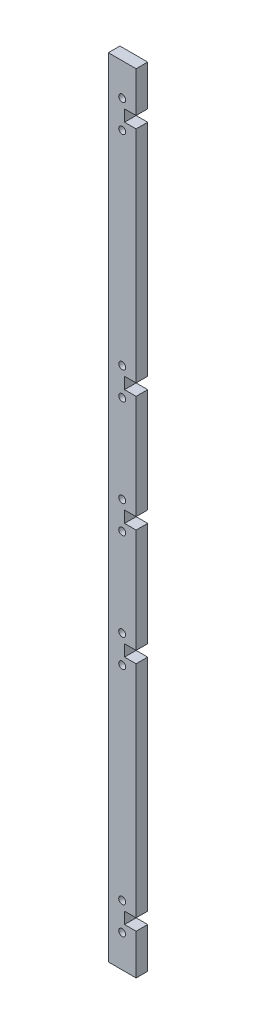
ISO-10303-21;
HEADER;
FILE_DESCRIPTION(('STEP AP214'),'2;1');
FILE_NAME('part.step','',(''),(''),'','','');
FILE_SCHEMA(('AUTOMOTIVE_DESIGN { 1 0 10303 214 1 1 1 1 }'));
ENDSEC;
DATA;
#1=APPLICATION_CONTEXT('core data for automotive mechanical design processes');
#2=APPLICATION_PROTOCOL_DEFINITION('international standard','automotive_design',2000,#1);
#3=PRODUCT_CONTEXT('',#1,'mechanical');
#4=PRODUCT('Part','Part','',(#3));
#5=PRODUCT_RELATED_PRODUCT_CATEGORY('part','',(#4));
#6=PRODUCT_DEFINITION_FORMATION('','',#4);
#7=PRODUCT_DEFINITION_CONTEXT('part definition',#1,'design');
#8=PRODUCT_DEFINITION('design','',#6,#7);
#9=PRODUCT_DEFINITION_SHAPE('','',#8);
#10=(LENGTH_UNIT() NAMED_UNIT(*) SI_UNIT(.MILLI.,.METRE.));
#11=(NAMED_UNIT(*) PLANE_ANGLE_UNIT() SI_UNIT($,.RADIAN.));
#12=(NAMED_UNIT(*) SI_UNIT($,.STERADIAN.) SOLID_ANGLE_UNIT());
#13=UNCERTAINTY_MEASURE_WITH_UNIT(LENGTH_MEASURE(1.E-05),#10,'distance_accuracy_value','');
#14=(GEOMETRIC_REPRESENTATION_CONTEXT(3) GLOBAL_UNCERTAINTY_ASSIGNED_CONTEXT((#13)) GLOBAL_UNIT_ASSIGNED_CONTEXT((#10,
#11,#12)) REPRESENTATION_CONTEXT('',''));
#15=CARTESIAN_POINT('',(0.,0.,0.));
#16=DIRECTION('',(0.,0.,1.));
#17=DIRECTION('',(1.,0.,0.));
#18=AXIS2_PLACEMENT_3D('',#15,#16,#17);
#19=CARTESIAN_POINT('',(0.,0.,5.));
#20=DIRECTION('',(0.,0.,1.));
#21=DIRECTION('',(1.,0.,0.));
#22=AXIS2_PLACEMENT_3D('',#19,#20,#21);
#23=PLANE('',#22);
#24=CARTESIAN_POINT('',(0.,126.,5.));
#25=DIRECTION('',(0.,0.,1.));
#26=DIRECTION('',(1.,0.,0.));
#27=AXIS2_PLACEMENT_3D('',#24,#25,#26);
#28=CIRCLE('',#27,1.5);
#29=CARTESIAN_POINT('',(1.49999999999998,126.,5.));
#30=VERTEX_POINT('',#29);
#31=EDGE_CURVE('E475',#30,#30,#28,.T.);
#32=ORIENTED_EDGE('',*,*,#31,.F.);
#33=EDGE_LOOP('',(#32));
#34=FACE_BOUND('',#33,.T.);
#35=CARTESIAN_POINT('',(0.,26.,5.));
#36=DIRECTION('',(0.,0.,1.));
#37=DIRECTION('',(1.,0.,0.));
#38=AXIS2_PLACEMENT_3D('',#35,#36,#37);
#39=CIRCLE('',#38,1.5);
#40=CARTESIAN_POINT('',(1.50000000000005,26.,5.));
#41=VERTEX_POINT('',#40);
#42=EDGE_CURVE('E487',#41,#41,#39,.T.);
#43=ORIENTED_EDGE('',*,*,#42,.F.);
#44=EDGE_LOOP('',(#43));
#45=FACE_BOUND('',#44,.T.);
#46=CARTESIAN_POINT('',(0.,176.,5.));
#47=DIRECTION('',(0.,0.,1.));
#48=DIRECTION('',(1.,0.,0.));
#49=AXIS2_PLACEMENT_3D('',#46,#47,#48);
#50=CIRCLE('',#49,1.5);
#51=CARTESIAN_POINT('',(1.50000000000003,176.,5.));
#52=VERTEX_POINT('',#51);
#53=EDGE_CURVE('E499',#52,#52,#50,.T.);
#54=ORIENTED_EDGE('',*,*,#53,.F.);
#55=EDGE_LOOP('',(#54));
#56=FACE_BOUND('',#55,.T.);
#57=CARTESIAN_POINT('',(0.,226.,5.));
#58=DIRECTION('',(0.,0.,1.));
#59=DIRECTION('',(1.,0.,0.));
#60=AXIS2_PLACEMENT_3D('',#57,#58,#59);
#61=CIRCLE('',#60,1.5);
#62=CARTESIAN_POINT('',(1.50000000000003,226.,5.));
#63=VERTEX_POINT('',#62);
#64=EDGE_CURVE('E511',#63,#63,#61,.T.);
#65=ORIENTED_EDGE('',*,*,#64,.F.);
#66=EDGE_LOOP('',(#65));
#67=FACE_BOUND('',#66,.T.);
#68=CARTESIAN_POINT('',(0.,326.,5.));
#69=DIRECTION('',(0.,0.,1.));
#70=DIRECTION('',(1.,0.,0.));
#71=AXIS2_PLACEMENT_3D('',#68,#69,#70);
#72=CIRCLE('',#71,1.5);
#73=CARTESIAN_POINT('',(1.50000000000001,326.,5.));
#74=VERTEX_POINT('',#73);
#75=EDGE_CURVE('E234',#74,#74,#72,.T.);
#76=ORIENTED_EDGE('',*,*,#75,.F.);
#77=EDGE_LOOP('',(#76));
#78=FACE_BOUND('',#77,.T.);
#79=DIRECTION('',(0.,-1.,0.));
#80=VECTOR('',#79,1.);
#81=CARTESIAN_POINT('',(-6.,340.,5.));
#82=LINE('',#81,#80);
#83=CARTESIAN_POINT('',(-6.,340.,5.));
#84=VERTEX_POINT('',#83);
#85=CARTESIAN_POINT('',(-5.99999999999995,0.,5.));
#86=VERTEX_POINT('',#85);
#87=EDGE_CURVE('E277',#84,#86,#82,.T.);
#88=ORIENTED_EDGE('',*,*,#87,.T.);
#89=DIRECTION('',(1.,0.,0.));
#90=VECTOR('',#89,1.);
#91=CARTESIAN_POINT('',(-5.99999999999995,0.,5.));
#92=LINE('',#91,#90);
#93=CARTESIAN_POINT('',(6.00000000000005,0.,5.));
#94=VERTEX_POINT('',#93);
#95=EDGE_CURVE('E145',#86,#94,#92,.T.);
#96=ORIENTED_EDGE('',*,*,#95,.T.);
#97=DIRECTION('',(0.,1.,0.));
#98=VECTOR('',#97,1.);
#99=CARTESIAN_POINT('',(6.,17.5,5.));
#100=LINE('',#99,#98);
#101=CARTESIAN_POINT('',(6.,17.5,5.));
#102=VERTEX_POINT('',#101);
#103=EDGE_CURVE('E340',#94,#102,#100,.T.);
#104=ORIENTED_EDGE('',*,*,#103,.T.);
#105=DIRECTION('',(-1.,0.,0.));
#106=VECTOR('',#105,1.);
#107=CARTESIAN_POINT('',(1.,17.5,5.));
#108=LINE('',#107,#106);
#109=CARTESIAN_POINT('',(1.,17.5,5.));
#110=VERTEX_POINT('',#109);
#111=EDGE_CURVE('E359',#102,#110,#108,.T.);
#112=ORIENTED_EDGE('',*,*,#111,.T.);
#113=DIRECTION('',(0.,1.,0.));
#114=VECTOR('',#113,1.);
#115=CARTESIAN_POINT('',(1.,22.5,5.));
#116=LINE('',#115,#114);
#117=CARTESIAN_POINT('',(1.,22.5,5.));
#118=VERTEX_POINT('',#117);
#119=EDGE_CURVE('E356',#110,#118,#116,.T.);
#120=ORIENTED_EDGE('',*,*,#119,.T.);
#121=DIRECTION('',(1.,0.,0.));
#122=VECTOR('',#121,1.);
#123=CARTESIAN_POINT('',(6.,22.5,5.));
#124=LINE('',#123,#122);
#125=CARTESIAN_POINT('',(6.,22.5,5.));
#126=VERTEX_POINT('',#125);
#127=EDGE_CURVE('E358',#118,#126,#124,.T.);
#128=ORIENTED_EDGE('',*,*,#127,.T.);
#129=DIRECTION('',(0.,1.,0.));
#130=VECTOR('',#129,1.);
#131=CARTESIAN_POINT('',(6.,117.5,5.));
#132=LINE('',#131,#130);
#133=CARTESIAN_POINT('',(6.,117.5,5.));
#134=VERTEX_POINT('',#133);
#135=EDGE_CURVE('E361',#126,#134,#132,.T.);
#136=ORIENTED_EDGE('',*,*,#135,.T.);
#137=DIRECTION('',(-1.,0.,0.));
#138=VECTOR('',#137,1.);
#139=CARTESIAN_POINT('',(1.,117.5,5.));
#140=LINE('',#139,#138);
#141=CARTESIAN_POINT('',(1.,117.5,5.));
#142=VERTEX_POINT('',#141);
#143=EDGE_CURVE('E367',#134,#142,#140,.T.);
#144=ORIENTED_EDGE('',*,*,#143,.T.);
#145=DIRECTION('',(0.,1.,0.));
#146=VECTOR('',#145,1.);
#147=CARTESIAN_POINT('',(1.,122.5,5.));
#148=LINE('',#147,#146);
#149=CARTESIAN_POINT('',(1.,122.5,5.));
#150=VERTEX_POINT('',#149);
#151=EDGE_CURVE('E369',#142,#150,#148,.T.);
#152=ORIENTED_EDGE('',*,*,#151,.T.);
#153=DIRECTION('',(1.,0.,0.));
#154=VECTOR('',#153,1.);
#155=CARTESIAN_POINT('',(6.,122.5,5.));
#156=LINE('',#155,#154);
#157=CARTESIAN_POINT('',(6.,122.5,5.));
#158=VERTEX_POINT('',#157);
#159=EDGE_CURVE('E371',#150,#158,#156,.T.);
#160=ORIENTED_EDGE('',*,*,#159,.T.);
#161=DIRECTION('',(0.,1.,0.));
#162=VECTOR('',#161,1.);
#163=CARTESIAN_POINT('',(6.,167.5,5.));
#164=LINE('',#163,#162);
#165=CARTESIAN_POINT('',(6.,167.5,5.));
#166=VERTEX_POINT('',#165);
#167=EDGE_CURVE('E373',#158,#166,#164,.T.);
#168=ORIENTED_EDGE('',*,*,#167,.T.);
#169=DIRECTION('',(-1.,0.,0.));
#170=VECTOR('',#169,1.);
#171=CARTESIAN_POINT('',(1.,167.5,5.));
#172=LINE('',#171,#170);
#173=CARTESIAN_POINT('',(1.,167.5,5.));
#174=VERTEX_POINT('',#173);
#175=EDGE_CURVE('E375',#166,#174,#172,.T.);
#176=ORIENTED_EDGE('',*,*,#175,.T.);
#177=DIRECTION('',(0.,1.,0.));
#178=VECTOR('',#177,1.);
#179=CARTESIAN_POINT('',(1.,172.5,5.));
#180=LINE('',#179,#178);
#181=CARTESIAN_POINT('',(1.,172.5,5.));
#182=VERTEX_POINT('',#181);
#183=EDGE_CURVE('E377',#174,#182,#180,.T.);
#184=ORIENTED_EDGE('',*,*,#183,.T.);
#185=DIRECTION('',(1.,0.,0.));
#186=VECTOR('',#185,1.);
#187=CARTESIAN_POINT('',(6.,172.5,5.));
#188=LINE('',#187,#186);
#189=CARTESIAN_POINT('',(6.,172.5,5.));
#190=VERTEX_POINT('',#189);
#191=EDGE_CURVE('E379',#182,#190,#188,.T.);
#192=ORIENTED_EDGE('',*,*,#191,.T.);
#193=DIRECTION('',(0.,1.,0.));
#194=VECTOR('',#193,1.);
#195=CARTESIAN_POINT('',(5.99999999999999,217.5,5.));
#196=LINE('',#195,#194);
#197=CARTESIAN_POINT('',(5.99999999999999,217.5,5.));
#198=VERTEX_POINT('',#197);
#199=EDGE_CURVE('E381',#190,#198,#196,.T.);
#200=ORIENTED_EDGE('',*,*,#199,.T.);
#201=DIRECTION('',(-1.,0.,0.));
#202=VECTOR('',#201,1.);
#203=CARTESIAN_POINT('',(1.00000000000001,217.5,5.));
#204=LINE('',#203,#202);
#205=CARTESIAN_POINT('',(1.00000000000001,217.5,5.));
#206=VERTEX_POINT('',#205);
#207=EDGE_CURVE('E383',#198,#206,#204,.T.);
#208=ORIENTED_EDGE('',*,*,#207,.T.);
#209=DIRECTION('',(0.,1.,0.));
#210=VECTOR('',#209,1.);
#211=CARTESIAN_POINT('',(1.00000000000001,222.5,5.));
#212=LINE('',#211,#210);
#213=CARTESIAN_POINT('',(1.00000000000001,222.5,5.));
#214=VERTEX_POINT('',#213);
#215=EDGE_CURVE('E385',#206,#214,#212,.T.);
#216=ORIENTED_EDGE('',*,*,#215,.T.);
#217=DIRECTION('',(1.,0.,0.));
#218=VECTOR('',#217,1.);
#219=CARTESIAN_POINT('',(5.99999999999999,222.5,5.));
#220=LINE('',#219,#218);
#221=CARTESIAN_POINT('',(5.99999999999999,222.5,5.));
#222=VERTEX_POINT('',#221);
#223=EDGE_CURVE('E387',#214,#222,#220,.T.);
#224=ORIENTED_EDGE('',*,*,#223,.T.);
#225=DIRECTION('',(0.,1.,0.));
#226=VECTOR('',#225,1.);
#227=CARTESIAN_POINT('',(6.,317.5,5.));
#228=LINE('',#227,#226);
#229=CARTESIAN_POINT('',(6.,317.5,5.));
#230=VERTEX_POINT('',#229);
#231=EDGE_CURVE('E389',#222,#230,#228,.T.);
#232=ORIENTED_EDGE('',*,*,#231,.T.);
#233=DIRECTION('',(-1.,0.,0.));
#234=VECTOR('',#233,1.);
#235=CARTESIAN_POINT('',(6.,317.5,5.));
#236=LINE('',#235,#234);
#237=CARTESIAN_POINT('',(1.,317.5,5.));
#238=VERTEX_POINT('',#237);
#239=EDGE_CURVE('E391',#230,#238,#236,.T.);
#240=ORIENTED_EDGE('',*,*,#239,.T.);
#241=DIRECTION('',(0.,1.,0.));
#242=VECTOR('',#241,1.);
#243=CARTESIAN_POINT('',(1.,317.5,5.));
#244=LINE('',#243,#242);
#245=CARTESIAN_POINT('',(1.,322.5,5.));
#246=VERTEX_POINT('',#245);
#247=EDGE_CURVE('E212',#238,#246,#244,.T.);
#248=ORIENTED_EDGE('',*,*,#247,.T.);
#249=DIRECTION('',(1.,0.,0.));
#250=VECTOR('',#249,1.);
#251=CARTESIAN_POINT('',(1.,322.5,5.));
#252=LINE('',#251,#250);
#253=CARTESIAN_POINT('',(6.,322.5,5.));
#254=VERTEX_POINT('',#253);
#255=EDGE_CURVE('E206',#246,#254,#252,.T.);
#256=ORIENTED_EDGE('',*,*,#255,.T.);
#257=DIRECTION('',(0.,1.,0.));
#258=VECTOR('',#257,1.);
#259=CARTESIAN_POINT('',(6.,340.,5.));
#260=LINE('',#259,#258);
#261=CARTESIAN_POINT('',(6.,340.,5.));
#262=VERTEX_POINT('',#261);
#263=EDGE_CURVE('E210',#254,#262,#260,.T.);
#264=ORIENTED_EDGE('',*,*,#263,.T.);
#265=DIRECTION('',(-1.,0.,0.));
#266=VECTOR('',#265,1.);
#267=CARTESIAN_POINT('',(6.,340.,5.));
#268=LINE('',#267,#266);
#269=EDGE_CURVE('E54',#262,#84,#268,.T.);
#270=ORIENTED_EDGE('',*,*,#269,.T.);
#271=EDGE_LOOP('',(#88,#96,#104,#112,#120,#128,#136,#144,#152,#160,#168,#176,#184,#192,#200,
#208,#216,#224,#232,#240,#248,#256,#264,#270));
#272=FACE_BOUND('',#271,.T.);
#273=CARTESIAN_POINT('',(0.,314.,5.));
#274=DIRECTION('',(0.,0.,1.));
#275=DIRECTION('',(-1.,0.,0.));
#276=AXIS2_PLACEMENT_3D('',#273,#274,#275);
#277=CIRCLE('',#276,1.5);
#278=CARTESIAN_POINT('',(-1.49999999999999,314.,5.));
#279=VERTEX_POINT('',#278);
#280=EDGE_CURVE('E517',#279,#279,#277,.T.);
#281=ORIENTED_EDGE('',*,*,#280,.F.);
#282=EDGE_LOOP('',(#281));
#283=FACE_BOUND('',#282,.T.);
#284=CARTESIAN_POINT('',(0.,214.,5.));
#285=DIRECTION('',(0.,0.,1.));
#286=DIRECTION('',(-1.,0.,0.));
#287=AXIS2_PLACEMENT_3D('',#284,#285,#286);
#288=CIRCLE('',#287,1.5);
#289=CARTESIAN_POINT('',(-1.49999999999998,214.,5.));
#290=VERTEX_POINT('',#289);
#291=EDGE_CURVE('E505',#290,#290,#288,.T.);
#292=ORIENTED_EDGE('',*,*,#291,.F.);
#293=EDGE_LOOP('',(#292));
#294=FACE_BOUND('',#293,.T.);
#295=CARTESIAN_POINT('',(0.,164.,5.));
#296=DIRECTION('',(0.,0.,1.));
#297=DIRECTION('',(-1.,0.,0.));
#298=AXIS2_PLACEMENT_3D('',#295,#296,#297);
#299=CIRCLE('',#298,1.5);
#300=CARTESIAN_POINT('',(-1.49999999999997,164.,5.));
#301=VERTEX_POINT('',#300);
#302=EDGE_CURVE('E493',#301,#301,#299,.T.);
#303=ORIENTED_EDGE('',*,*,#302,.F.);
#304=EDGE_LOOP('',(#303));
#305=FACE_BOUND('',#304,.T.);
#306=CARTESIAN_POINT('',(0.,14.,5.));
#307=DIRECTION('',(0.,0.,1.));
#308=DIRECTION('',(-1.,0.,0.));
#309=AXIS2_PLACEMENT_3D('',#306,#307,#308);
#310=CIRCLE('',#309,1.5);
#311=CARTESIAN_POINT('',(-1.49999999999995,14.,5.));
#312=VERTEX_POINT('',#311);
#313=EDGE_CURVE('E481',#312,#312,#310,.T.);
#314=ORIENTED_EDGE('',*,*,#313,.F.);
#315=EDGE_LOOP('',(#314));
#316=FACE_BOUND('',#315,.T.);
#317=CARTESIAN_POINT('',(0.,114.,5.));
#318=DIRECTION('',(0.,0.,1.));
#319=DIRECTION('',(-1.,0.,0.));
#320=AXIS2_PLACEMENT_3D('',#317,#318,#319);
#321=CIRCLE('',#320,1.5);
#322=CARTESIAN_POINT('',(-1.50000000000002,114.,5.));
#323=VERTEX_POINT('',#322);
#324=EDGE_CURVE('E466',#323,#323,#321,.T.);
#325=ORIENTED_EDGE('',*,*,#324,.F.);
#326=EDGE_LOOP('',(#325));
#327=FACE_BOUND('',#326,.T.);
#328=ADVANCED_FACE('F37',(#34,#45,#56,#67,#78,#272,#283,#294,#305,#316,#327),#23,.T.);
#329=CARTESIAN_POINT('',(0.,0.,0.));
#330=DIRECTION('',(0.,0.,1.));
#331=DIRECTION('',(1.,0.,0.));
#332=AXIS2_PLACEMENT_3D('',#329,#330,#331);
#333=PLANE('',#332);
#334=DIRECTION('',(0.,-1.,0.));
#335=VECTOR('',#334,1.);
#336=CARTESIAN_POINT('',(-6.,340.,0.));
#337=LINE('',#336,#335);
#338=CARTESIAN_POINT('',(-6.,340.,0.));
#339=VERTEX_POINT('',#338);
#340=CARTESIAN_POINT('',(-5.99999999999995,0.,0.));
#341=VERTEX_POINT('',#340);
#342=EDGE_CURVE('E230',#339,#341,#337,.T.);
#343=ORIENTED_EDGE('',*,*,#342,.F.);
#344=DIRECTION('',(-1.,0.,0.));
#345=VECTOR('',#344,1.);
#346=CARTESIAN_POINT('',(6.,340.,0.));
#347=LINE('',#346,#345);
#348=CARTESIAN_POINT('',(6.,340.,0.));
#349=VERTEX_POINT('',#348);
#350=EDGE_CURVE('E137',#349,#339,#347,.T.);
#351=ORIENTED_EDGE('',*,*,#350,.F.);
#352=DIRECTION('',(0.,1.,0.));
#353=VECTOR('',#352,1.);
#354=CARTESIAN_POINT('',(6.,340.,0.));
#355=LINE('',#354,#353);
#356=CARTESIAN_POINT('',(6.,322.5,0.));
#357=VERTEX_POINT('',#356);
#358=EDGE_CURVE('E131',#357,#349,#355,.T.);
#359=ORIENTED_EDGE('',*,*,#358,.F.);
#360=DIRECTION('',(1.,0.,0.));
#361=VECTOR('',#360,1.);
#362=CARTESIAN_POINT('',(1.,322.5,0.));
#363=LINE('',#362,#361);
#364=CARTESIAN_POINT('',(1.,322.5,0.));
#365=VERTEX_POINT('',#364);
#366=EDGE_CURVE('E220',#365,#357,#363,.T.);
#367=ORIENTED_EDGE('',*,*,#366,.F.);
#368=DIRECTION('',(0.,1.,0.));
#369=VECTOR('',#368,1.);
#370=CARTESIAN_POINT('',(1.,317.5,0.));
#371=LINE('',#370,#369);
#372=CARTESIAN_POINT('',(1.,317.5,0.));
#373=VERTEX_POINT('',#372);
#374=EDGE_CURVE('E272',#373,#365,#371,.T.);
#375=ORIENTED_EDGE('',*,*,#374,.F.);
#376=DIRECTION('',(-1.,0.,0.));
#377=VECTOR('',#376,1.);
#378=CARTESIAN_POINT('',(6.,317.5,0.));
#379=LINE('',#378,#377);
#380=CARTESIAN_POINT('',(6.,317.5,0.));
#381=VERTEX_POINT('',#380);
#382=EDGE_CURVE('E270',#381,#373,#379,.T.);
#383=ORIENTED_EDGE('',*,*,#382,.F.);
#384=DIRECTION('',(0.,1.,0.));
#385=VECTOR('',#384,1.);
#386=CARTESIAN_POINT('',(6.,317.5,0.));
#387=LINE('',#386,#385);
#388=CARTESIAN_POINT('',(5.99999999999999,222.5,0.));
#389=VERTEX_POINT('',#388);
#390=EDGE_CURVE('E268',#389,#381,#387,.T.);
#391=ORIENTED_EDGE('',*,*,#390,.F.);
#392=DIRECTION('',(1.,0.,0.));
#393=VECTOR('',#392,1.);
#394=CARTESIAN_POINT('',(5.99999999999999,222.5,0.));
#395=LINE('',#394,#393);
#396=CARTESIAN_POINT('',(1.00000000000001,222.5,0.));
#397=VERTEX_POINT('',#396);
#398=EDGE_CURVE('E266',#397,#389,#395,.T.);
#399=ORIENTED_EDGE('',*,*,#398,.F.);
#400=DIRECTION('',(0.,1.,0.));
#401=VECTOR('',#400,1.);
#402=CARTESIAN_POINT('',(1.00000000000001,222.5,0.));
#403=LINE('',#402,#401);
#404=CARTESIAN_POINT('',(1.00000000000001,217.5,0.));
#405=VERTEX_POINT('',#404);
#406=EDGE_CURVE('E264',#405,#397,#403,.T.);
#407=ORIENTED_EDGE('',*,*,#406,.F.);
#408=DIRECTION('',(-1.,0.,0.));
#409=VECTOR('',#408,1.);
#410=CARTESIAN_POINT('',(1.00000000000001,217.5,0.));
#411=LINE('',#410,#409);
#412=CARTESIAN_POINT('',(5.99999999999999,217.5,0.));
#413=VERTEX_POINT('',#412);
#414=EDGE_CURVE('E262',#413,#405,#411,.T.);
#415=ORIENTED_EDGE('',*,*,#414,.F.);
#416=DIRECTION('',(0.,1.,0.));
#417=VECTOR('',#416,1.);
#418=CARTESIAN_POINT('',(5.99999999999999,217.5,0.));
#419=LINE('',#418,#417);
#420=CARTESIAN_POINT('',(6.,172.5,0.));
#421=VERTEX_POINT('',#420);
#422=EDGE_CURVE('E260',#421,#413,#419,.T.);
#423=ORIENTED_EDGE('',*,*,#422,.F.);
#424=DIRECTION('',(1.,0.,0.));
#425=VECTOR('',#424,1.);
#426=CARTESIAN_POINT('',(6.,172.5,0.));
#427=LINE('',#426,#425);
#428=CARTESIAN_POINT('',(1.,172.5,0.));
#429=VERTEX_POINT('',#428);
#430=EDGE_CURVE('E258',#429,#421,#427,.T.);
#431=ORIENTED_EDGE('',*,*,#430,.F.);
#432=DIRECTION('',(0.,1.,0.));
#433=VECTOR('',#432,1.);
#434=CARTESIAN_POINT('',(1.,172.5,0.));
#435=LINE('',#434,#433);
#436=CARTESIAN_POINT('',(1.,167.5,0.));
#437=VERTEX_POINT('',#436);
#438=EDGE_CURVE('E256',#437,#429,#435,.T.);
#439=ORIENTED_EDGE('',*,*,#438,.F.);
#440=DIRECTION('',(-1.,0.,0.));
#441=VECTOR('',#440,1.);
#442=CARTESIAN_POINT('',(1.,167.5,0.));
#443=LINE('',#442,#441);
#444=CARTESIAN_POINT('',(6.,167.5,0.));
#445=VERTEX_POINT('',#444);
#446=EDGE_CURVE('E254',#445,#437,#443,.T.);
#447=ORIENTED_EDGE('',*,*,#446,.F.);
#448=DIRECTION('',(0.,1.,0.));
#449=VECTOR('',#448,1.);
#450=CARTESIAN_POINT('',(6.,167.5,0.));
#451=LINE('',#450,#449);
#452=CARTESIAN_POINT('',(6.,122.5,0.));
#453=VERTEX_POINT('',#452);
#454=EDGE_CURVE('E252',#453,#445,#451,.T.);
#455=ORIENTED_EDGE('',*,*,#454,.F.);
#456=DIRECTION('',(1.,0.,0.));
#457=VECTOR('',#456,1.);
#458=CARTESIAN_POINT('',(6.,122.5,0.));
#459=LINE('',#458,#457);
#460=CARTESIAN_POINT('',(1.,122.5,0.));
#461=VERTEX_POINT('',#460);
#462=EDGE_CURVE('E250',#461,#453,#459,.T.);
#463=ORIENTED_EDGE('',*,*,#462,.F.);
#464=DIRECTION('',(0.,1.,0.));
#465=VECTOR('',#464,1.);
#466=CARTESIAN_POINT('',(1.,122.5,0.));
#467=LINE('',#466,#465);
#468=CARTESIAN_POINT('',(1.,117.5,0.));
#469=VERTEX_POINT('',#468);
#470=EDGE_CURVE('E248',#469,#461,#467,.T.);
#471=ORIENTED_EDGE('',*,*,#470,.F.);
#472=DIRECTION('',(-1.,0.,0.));
#473=VECTOR('',#472,1.);
#474=CARTESIAN_POINT('',(1.,117.5,0.));
#475=LINE('',#474,#473);
#476=CARTESIAN_POINT('',(6.,117.5,0.));
#477=VERTEX_POINT('',#476);
#478=EDGE_CURVE('E246',#477,#469,#475,.T.);
#479=ORIENTED_EDGE('',*,*,#478,.F.);
#480=DIRECTION('',(0.,1.,0.));
#481=VECTOR('',#480,1.);
#482=CARTESIAN_POINT('',(6.,117.5,0.));
#483=LINE('',#482,#481);
#484=CARTESIAN_POINT('',(6.,22.5,0.));
#485=VERTEX_POINT('',#484);
#486=EDGE_CURVE('E244',#485,#477,#483,.T.);
#487=ORIENTED_EDGE('',*,*,#486,.F.);
#488=DIRECTION('',(1.,0.,0.));
#489=VECTOR('',#488,1.);
#490=CARTESIAN_POINT('',(6.,22.5,0.));
#491=LINE('',#490,#489);
#492=CARTESIAN_POINT('',(1.,22.5,0.));
#493=VERTEX_POINT('',#492);
#494=EDGE_CURVE('E242',#493,#485,#491,.T.);
#495=ORIENTED_EDGE('',*,*,#494,.F.);
#496=DIRECTION('',(0.,1.,0.));
#497=VECTOR('',#496,1.);
#498=CARTESIAN_POINT('',(1.,22.5,0.));
#499=LINE('',#498,#497);
#500=CARTESIAN_POINT('',(1.,17.5,0.));
#501=VERTEX_POINT('',#500);
#502=EDGE_CURVE('E240',#501,#493,#499,.T.);
#503=ORIENTED_EDGE('',*,*,#502,.F.);
#504=DIRECTION('',(-1.,0.,0.));
#505=VECTOR('',#504,1.);
#506=CARTESIAN_POINT('',(1.,17.5,0.));
#507=LINE('',#506,#505);
#508=CARTESIAN_POINT('',(6.,17.5,0.));
#509=VERTEX_POINT('',#508);
#510=EDGE_CURVE('E238',#509,#501,#507,.T.);
#511=ORIENTED_EDGE('',*,*,#510,.F.);
#512=DIRECTION('',(0.,1.,0.));
#513=VECTOR('',#512,1.);
#514=CARTESIAN_POINT('',(6.,17.5,0.));
#515=LINE('',#514,#513);
#516=CARTESIAN_POINT('',(6.00000000000005,0.,0.));
#517=VERTEX_POINT('',#516);
#518=EDGE_CURVE('E236',#517,#509,#515,.T.);
#519=ORIENTED_EDGE('',*,*,#518,.F.);
#520=DIRECTION('',(1.,0.,0.));
#521=VECTOR('',#520,1.);
#522=CARTESIAN_POINT('',(-5.99999999999995,0.,0.));
#523=LINE('',#522,#521);
#524=EDGE_CURVE('E233',#341,#517,#523,.T.);
#525=ORIENTED_EDGE('',*,*,#524,.F.);
#526=EDGE_LOOP('',(#343,#351,#359,#367,#375,#383,#391,#399,#407,#415,#423,#431,#439,#447,#455,
#463,#471,#479,#487,#495,#503,#511,#519,#525));
#527=FACE_BOUND('',#526,.T.);
#528=CARTESIAN_POINT('',(0.,326.,0.));
#529=DIRECTION('',(0.,0.,1.));
#530=DIRECTION('',(1.,0.,0.));
#531=AXIS2_PLACEMENT_3D('',#528,#529,#530);
#532=CIRCLE('',#531,1.5);
#533=CARTESIAN_POINT('',(1.50000000000001,326.,0.));
#534=VERTEX_POINT('',#533);
#535=EDGE_CURVE('E520',#534,#534,#532,.T.);
#536=ORIENTED_EDGE('',*,*,#535,.T.);
#537=EDGE_LOOP('',(#536));
#538=FACE_BOUND('',#537,.T.);
#539=CARTESIAN_POINT('',(0.,314.,0.));
#540=DIRECTION('',(0.,0.,1.));
#541=DIRECTION('',(-1.,0.,0.));
#542=AXIS2_PLACEMENT_3D('',#539,#540,#541);
#543=CIRCLE('',#542,1.5);
#544=CARTESIAN_POINT('',(-1.49999999999999,314.,0.));
#545=VERTEX_POINT('',#544);
#546=EDGE_CURVE('E514',#545,#545,#543,.T.);
#547=ORIENTED_EDGE('',*,*,#546,.T.);
#548=EDGE_LOOP('',(#547));
#549=FACE_BOUND('',#548,.T.);
#550=CARTESIAN_POINT('',(0.,226.,0.));
#551=DIRECTION('',(0.,0.,1.));
#552=DIRECTION('',(1.,0.,0.));
#553=AXIS2_PLACEMENT_3D('',#550,#551,#552);
#554=CIRCLE('',#553,1.5);
#555=CARTESIAN_POINT('',(1.50000000000003,226.,0.));
#556=VERTEX_POINT('',#555);
#557=EDGE_CURVE('E508',#556,#556,#554,.T.);
#558=ORIENTED_EDGE('',*,*,#557,.T.);
#559=EDGE_LOOP('',(#558));
#560=FACE_BOUND('',#559,.T.);
#561=CARTESIAN_POINT('',(0.,214.,0.));
#562=DIRECTION('',(0.,0.,1.));
#563=DIRECTION('',(-1.,0.,0.));
#564=AXIS2_PLACEMENT_3D('',#561,#562,#563);
#565=CIRCLE('',#564,1.5);
#566=CARTESIAN_POINT('',(-1.49999999999998,214.,0.));
#567=VERTEX_POINT('',#566);
#568=EDGE_CURVE('E502',#567,#567,#565,.T.);
#569=ORIENTED_EDGE('',*,*,#568,.T.);
#570=EDGE_LOOP('',(#569));
#571=FACE_BOUND('',#570,.T.);
#572=CARTESIAN_POINT('',(0.,176.,0.));
#573=DIRECTION('',(0.,0.,1.));
#574=DIRECTION('',(1.,0.,0.));
#575=AXIS2_PLACEMENT_3D('',#572,#573,#574);
#576=CIRCLE('',#575,1.5);
#577=CARTESIAN_POINT('',(1.50000000000003,176.,0.));
#578=VERTEX_POINT('',#577);
#579=EDGE_CURVE('E496',#578,#578,#576,.T.);
#580=ORIENTED_EDGE('',*,*,#579,.T.);
#581=EDGE_LOOP('',(#580));
#582=FACE_BOUND('',#581,.T.);
#583=CARTESIAN_POINT('',(0.,164.,0.));
#584=DIRECTION('',(0.,0.,1.));
#585=DIRECTION('',(-1.,0.,0.));
#586=AXIS2_PLACEMENT_3D('',#583,#584,#585);
#587=CIRCLE('',#586,1.5);
#588=CARTESIAN_POINT('',(-1.49999999999997,164.,0.));
#589=VERTEX_POINT('',#588);
#590=EDGE_CURVE('E490',#589,#589,#587,.T.);
#591=ORIENTED_EDGE('',*,*,#590,.T.);
#592=EDGE_LOOP('',(#591));
#593=FACE_BOUND('',#592,.T.);
#594=CARTESIAN_POINT('',(0.,26.,0.));
#595=DIRECTION('',(0.,0.,1.));
#596=DIRECTION('',(1.,0.,0.));
#597=AXIS2_PLACEMENT_3D('',#594,#595,#596);
#598=CIRCLE('',#597,1.5);
#599=CARTESIAN_POINT('',(1.50000000000005,26.,0.));
#600=VERTEX_POINT('',#599);
#601=EDGE_CURVE('E484',#600,#600,#598,.T.);
#602=ORIENTED_EDGE('',*,*,#601,.T.);
#603=EDGE_LOOP('',(#602));
#604=FACE_BOUND('',#603,.T.);
#605=CARTESIAN_POINT('',(0.,14.,0.));
#606=DIRECTION('',(0.,0.,1.));
#607=DIRECTION('',(-1.,0.,0.));
#608=AXIS2_PLACEMENT_3D('',#605,#606,#607);
#609=CIRCLE('',#608,1.5);
#610=CARTESIAN_POINT('',(-1.49999999999995,14.,0.));
#611=VERTEX_POINT('',#610);
#612=EDGE_CURVE('E478',#611,#611,#609,.T.);
#613=ORIENTED_EDGE('',*,*,#612,.T.);
#614=EDGE_LOOP('',(#613));
#615=FACE_BOUND('',#614,.T.);
#616=CARTESIAN_POINT('',(0.,126.,0.));
#617=DIRECTION('',(0.,0.,1.));
#618=DIRECTION('',(1.,0.,0.));
#619=AXIS2_PLACEMENT_3D('',#616,#617,#618);
#620=CIRCLE('',#619,1.5);
#621=CARTESIAN_POINT('',(1.49999999999998,126.,0.));
#622=VERTEX_POINT('',#621);
#623=EDGE_CURVE('E472',#622,#622,#620,.T.);
#624=ORIENTED_EDGE('',*,*,#623,.T.);
#625=EDGE_LOOP('',(#624));
#626=FACE_BOUND('',#625,.T.);
#627=CARTESIAN_POINT('',(0.,114.,0.));
#628=DIRECTION('',(0.,0.,1.));
#629=DIRECTION('',(-1.,0.,0.));
#630=AXIS2_PLACEMENT_3D('',#627,#628,#629);
#631=CIRCLE('',#630,1.5);
#632=CARTESIAN_POINT('',(-1.50000000000002,114.,0.));
#633=VERTEX_POINT('',#632);
#634=EDGE_CURVE('E469',#633,#633,#631,.T.);
#635=ORIENTED_EDGE('',*,*,#634,.T.);
#636=EDGE_LOOP('',(#635));
#637=FACE_BOUND('',#636,.T.);
#638=ADVANCED_FACE('F344',(#527,#538,#549,#560,#571,#582,#593,#604,#615,#626,#637),#333,.F.);
#639=CARTESIAN_POINT('',(-6.,340.,5.));
#640=DIRECTION('',(1.,0.,0.));
#641=DIRECTION('',(0.,1.,0.));
#642=AXIS2_PLACEMENT_3D('',#639,#640,#641);
#643=PLANE('',#642);
#644=ORIENTED_EDGE('',*,*,#342,.T.);
#645=DIRECTION('',(0.,0.,-1.));
#646=VECTOR('',#645,1.);
#647=CARTESIAN_POINT('',(-5.99999999999995,0.,5.));
#648=LINE('',#647,#646);
#649=EDGE_CURVE('E11',#86,#341,#648,.T.);
#650=ORIENTED_EDGE('',*,*,#649,.F.);
#651=ORIENTED_EDGE('',*,*,#87,.F.);
#652=DIRECTION('',(0.,0.,-1.));
#653=VECTOR('',#652,1.);
#654=CARTESIAN_POINT('',(-6.,340.,5.));
#655=LINE('',#654,#653);
#656=EDGE_CURVE('E226',#84,#339,#655,.T.);
#657=ORIENTED_EDGE('',*,*,#656,.T.);
#658=EDGE_LOOP('',(#644,#650,#651,#657));
#659=FACE_BOUND('',#658,.T.);
#660=ADVANCED_FACE('F39',(#659),#643,.F.);
#661=CARTESIAN_POINT('',(-5.99999999999995,0.,5.));
#662=DIRECTION('',(0.,1.,0.));
#663=DIRECTION('',(-1.,0.,0.));
#664=AXIS2_PLACEMENT_3D('',#661,#662,#663);
#665=PLANE('',#664);
#666=ORIENTED_EDGE('',*,*,#524,.T.);
#667=DIRECTION('',(0.,0.,-1.));
#668=VECTOR('',#667,1.);
#669=CARTESIAN_POINT('',(6.00000000000005,0.,5.));
#670=LINE('',#669,#668);
#671=EDGE_CURVE('E46',#94,#517,#670,.T.);
#672=ORIENTED_EDGE('',*,*,#671,.F.);
#673=ORIENTED_EDGE('',*,*,#95,.F.);
#674=ORIENTED_EDGE('',*,*,#649,.T.);
#675=EDGE_LOOP('',(#666,#672,#673,#674));
#676=FACE_BOUND('',#675,.T.);
#677=ADVANCED_FACE('F826',(#676),#665,.F.);
#678=CARTESIAN_POINT('',(6.,17.5,5.));
#679=DIRECTION('',(-1.,0.,0.));
#680=DIRECTION('',(0.,-1.,0.));
#681=AXIS2_PLACEMENT_3D('',#678,#679,#680);
#682=PLANE('',#681);
#683=ORIENTED_EDGE('',*,*,#518,.T.);
#684=DIRECTION('',(0.,0.,-1.));
#685=VECTOR('',#684,1.);
#686=CARTESIAN_POINT('',(6.,17.5,5.));
#687=LINE('',#686,#685);
#688=EDGE_CURVE('E332',#102,#509,#687,.T.);
#689=ORIENTED_EDGE('',*,*,#688,.F.);
#690=ORIENTED_EDGE('',*,*,#103,.F.);
#691=ORIENTED_EDGE('',*,*,#671,.T.);
#692=EDGE_LOOP('',(#683,#689,#690,#691));
#693=FACE_BOUND('',#692,.T.);
#694=ADVANCED_FACE('F338',(#693),#682,.F.);
#695=CARTESIAN_POINT('',(1.,17.5,5.));
#696=DIRECTION('',(0.,-1.,0.));
#697=DIRECTION('',(0.,0.,-1.));
#698=AXIS2_PLACEMENT_3D('',#695,#696,#697);
#699=PLANE('',#698);
#700=ORIENTED_EDGE('',*,*,#510,.T.);
#701=DIRECTION('',(0.,0.,-1.));
#702=VECTOR('',#701,1.);
#703=CARTESIAN_POINT('',(1.,17.5,5.));
#704=LINE('',#703,#702);
#705=EDGE_CURVE('E329',#110,#501,#704,.T.);
#706=ORIENTED_EDGE('',*,*,#705,.F.);
#707=ORIENTED_EDGE('',*,*,#111,.F.);
#708=ORIENTED_EDGE('',*,*,#688,.T.);
#709=EDGE_LOOP('',(#700,#706,#707,#708));
#710=FACE_BOUND('',#709,.T.);
#711=ADVANCED_FACE('F350',(#710),#699,.F.);
#712=CARTESIAN_POINT('',(1.,22.5,5.));
#713=DIRECTION('',(-1.,0.,0.));
#714=DIRECTION('',(0.,0.,1.));
#715=AXIS2_PLACEMENT_3D('',#712,#713,#714);
#716=PLANE('',#715);
#717=ORIENTED_EDGE('',*,*,#502,.T.);
#718=DIRECTION('',(0.,0.,-1.));
#719=VECTOR('',#718,1.);
#720=CARTESIAN_POINT('',(1.,22.5,5.));
#721=LINE('',#720,#719);
#722=EDGE_CURVE('E326',#118,#493,#721,.T.);
#723=ORIENTED_EDGE('',*,*,#722,.F.);
#724=ORIENTED_EDGE('',*,*,#119,.F.);
#725=ORIENTED_EDGE('',*,*,#705,.T.);
#726=EDGE_LOOP('',(#717,#723,#724,#725));
#727=FACE_BOUND('',#726,.T.);
#728=ADVANCED_FACE('F354',(#727),#716,.F.);
#729=CARTESIAN_POINT('',(6.,22.5,5.));
#730=DIRECTION('',(0.,1.,0.));
#731=DIRECTION('',(0.,0.,1.));
#732=AXIS2_PLACEMENT_3D('',#729,#730,#731);
#733=PLANE('',#732);
#734=ORIENTED_EDGE('',*,*,#494,.T.);
#735=DIRECTION('',(0.,0.,-1.));
#736=VECTOR('',#735,1.);
#737=CARTESIAN_POINT('',(6.,22.5,5.));
#738=LINE('',#737,#736);
#739=EDGE_CURVE('E323',#126,#485,#738,.T.);
#740=ORIENTED_EDGE('',*,*,#739,.F.);
#741=ORIENTED_EDGE('',*,*,#127,.F.);
#742=ORIENTED_EDGE('',*,*,#722,.T.);
#743=EDGE_LOOP('',(#734,#740,#741,#742));
#744=FACE_BOUND('',#743,.T.);
#745=ADVANCED_FACE('F787',(#744),#733,.F.);
#746=CARTESIAN_POINT('',(6.,117.5,5.));
#747=DIRECTION('',(-1.,0.,0.));
#748=DIRECTION('',(0.,0.,1.));
#749=AXIS2_PLACEMENT_3D('',#746,#747,#748);
#750=PLANE('',#749);
#751=ORIENTED_EDGE('',*,*,#486,.T.);
#752=DIRECTION('',(0.,0.,-1.));
#753=VECTOR('',#752,1.);
#754=CARTESIAN_POINT('',(6.,117.5,5.));
#755=LINE('',#754,#753);
#756=EDGE_CURVE('E320',#134,#477,#755,.T.);
#757=ORIENTED_EDGE('',*,*,#756,.F.);
#758=ORIENTED_EDGE('',*,*,#135,.F.);
#759=ORIENTED_EDGE('',*,*,#739,.T.);
#760=EDGE_LOOP('',(#751,#757,#758,#759));
#761=FACE_BOUND('',#760,.T.);
#762=ADVANCED_FACE('F776',(#761),#750,.F.);
#763=CARTESIAN_POINT('',(1.,117.5,5.));
#764=DIRECTION('',(0.,-1.,0.));
#765=DIRECTION('',(0.,0.,-1.));
#766=AXIS2_PLACEMENT_3D('',#763,#764,#765);
#767=PLANE('',#766);
#768=ORIENTED_EDGE('',*,*,#478,.T.);
#769=DIRECTION('',(0.,0.,-1.));
#770=VECTOR('',#769,1.);
#771=CARTESIAN_POINT('',(1.,117.5,5.));
#772=LINE('',#771,#770);
#773=EDGE_CURVE('E317',#142,#469,#772,.T.);
#774=ORIENTED_EDGE('',*,*,#773,.F.);
#775=ORIENTED_EDGE('',*,*,#143,.F.);
#776=ORIENTED_EDGE('',*,*,#756,.T.);
#777=EDGE_LOOP('',(#768,#774,#775,#776));
#778=FACE_BOUND('',#777,.T.);
#779=ADVANCED_FACE('F765',(#778),#767,.F.);
#780=CARTESIAN_POINT('',(1.,122.5,5.));
#781=DIRECTION('',(-1.,0.,0.));
#782=DIRECTION('',(0.,0.,1.));
#783=AXIS2_PLACEMENT_3D('',#780,#781,#782);
#784=PLANE('',#783);
#785=ORIENTED_EDGE('',*,*,#470,.T.);
#786=DIRECTION('',(0.,0.,-1.));
#787=VECTOR('',#786,1.);
#788=CARTESIAN_POINT('',(1.,122.5,5.));
#789=LINE('',#788,#787);
#790=EDGE_CURVE('E314',#150,#461,#789,.T.);
#791=ORIENTED_EDGE('',*,*,#790,.F.);
#792=ORIENTED_EDGE('',*,*,#151,.F.);
#793=ORIENTED_EDGE('',*,*,#773,.T.);
#794=EDGE_LOOP('',(#785,#791,#792,#793));
#795=FACE_BOUND('',#794,.T.);
#796=ADVANCED_FACE('F754',(#795),#784,.F.);
#797=CARTESIAN_POINT('',(6.,122.5,5.));
#798=DIRECTION('',(0.,1.,0.));
#799=DIRECTION('',(0.,0.,1.));
#800=AXIS2_PLACEMENT_3D('',#797,#798,#799);
#801=PLANE('',#800);
#802=ORIENTED_EDGE('',*,*,#462,.T.);
#803=DIRECTION('',(0.,0.,-1.));
#804=VECTOR('',#803,1.);
#805=CARTESIAN_POINT('',(6.,122.5,5.));
#806=LINE('',#805,#804);
#807=EDGE_CURVE('E311',#158,#453,#806,.T.);
#808=ORIENTED_EDGE('',*,*,#807,.F.);
#809=ORIENTED_EDGE('',*,*,#159,.F.);
#810=ORIENTED_EDGE('',*,*,#790,.T.);
#811=EDGE_LOOP('',(#802,#808,#809,#810));
#812=FACE_BOUND('',#811,.T.);
#813=ADVANCED_FACE('F743',(#812),#801,.F.);
#814=CARTESIAN_POINT('',(6.,167.5,5.));
#815=DIRECTION('',(-1.,0.,0.));
#816=DIRECTION('',(0.,0.,1.));
#817=AXIS2_PLACEMENT_3D('',#814,#815,#816);
#818=PLANE('',#817);
#819=ORIENTED_EDGE('',*,*,#454,.T.);
#820=DIRECTION('',(0.,0.,-1.));
#821=VECTOR('',#820,1.);
#822=CARTESIAN_POINT('',(6.,167.5,5.));
#823=LINE('',#822,#821);
#824=EDGE_CURVE('E308',#166,#445,#823,.T.);
#825=ORIENTED_EDGE('',*,*,#824,.F.);
#826=ORIENTED_EDGE('',*,*,#167,.F.);
#827=ORIENTED_EDGE('',*,*,#807,.T.);
#828=EDGE_LOOP('',(#819,#825,#826,#827));
#829=FACE_BOUND('',#828,.T.);
#830=ADVANCED_FACE('F732',(#829),#818,.F.);
#831=CARTESIAN_POINT('',(1.,167.5,5.));
#832=DIRECTION('',(0.,-1.,0.));
#833=DIRECTION('',(0.,0.,-1.));
#834=AXIS2_PLACEMENT_3D('',#831,#832,#833);
#835=PLANE('',#834);
#836=ORIENTED_EDGE('',*,*,#446,.T.);
#837=DIRECTION('',(0.,0.,-1.));
#838=VECTOR('',#837,1.);
#839=CARTESIAN_POINT('',(1.,167.5,5.));
#840=LINE('',#839,#838);
#841=EDGE_CURVE('E305',#174,#437,#840,.T.);
#842=ORIENTED_EDGE('',*,*,#841,.F.);
#843=ORIENTED_EDGE('',*,*,#175,.F.);
#844=ORIENTED_EDGE('',*,*,#824,.T.);
#845=EDGE_LOOP('',(#836,#842,#843,#844));
#846=FACE_BOUND('',#845,.T.);
#847=ADVANCED_FACE('F721',(#846),#835,.F.);
#848=CARTESIAN_POINT('',(1.,172.5,5.));
#849=DIRECTION('',(-1.,0.,0.));
#850=DIRECTION('',(0.,0.,1.));
#851=AXIS2_PLACEMENT_3D('',#848,#849,#850);
#852=PLANE('',#851);
#853=ORIENTED_EDGE('',*,*,#438,.T.);
#854=DIRECTION('',(0.,0.,-1.));
#855=VECTOR('',#854,1.);
#856=CARTESIAN_POINT('',(1.,172.5,5.));
#857=LINE('',#856,#855);
#858=EDGE_CURVE('E302',#182,#429,#857,.T.);
#859=ORIENTED_EDGE('',*,*,#858,.F.);
#860=ORIENTED_EDGE('',*,*,#183,.F.);
#861=ORIENTED_EDGE('',*,*,#841,.T.);
#862=EDGE_LOOP('',(#853,#859,#860,#861));
#863=FACE_BOUND('',#862,.T.);
#864=ADVANCED_FACE('F710',(#863),#852,.F.);
#865=CARTESIAN_POINT('',(6.,172.5,5.));
#866=DIRECTION('',(0.,1.,0.));
#867=DIRECTION('',(0.,0.,1.));
#868=AXIS2_PLACEMENT_3D('',#865,#866,#867);
#869=PLANE('',#868);
#870=ORIENTED_EDGE('',*,*,#430,.T.);
#871=DIRECTION('',(0.,0.,-1.));
#872=VECTOR('',#871,1.);
#873=CARTESIAN_POINT('',(6.,172.5,5.));
#874=LINE('',#873,#872);
#875=EDGE_CURVE('E299',#190,#421,#874,.T.);
#876=ORIENTED_EDGE('',*,*,#875,.F.);
#877=ORIENTED_EDGE('',*,*,#191,.F.);
#878=ORIENTED_EDGE('',*,*,#858,.T.);
#879=EDGE_LOOP('',(#870,#876,#877,#878));
#880=FACE_BOUND('',#879,.T.);
#881=ADVANCED_FACE('F699',(#880),#869,.F.);
#882=CARTESIAN_POINT('',(5.99999999999999,217.5,5.));
#883=DIRECTION('',(-1.,0.,0.));
#884=DIRECTION('',(0.,-1.,0.));
#885=AXIS2_PLACEMENT_3D('',#882,#883,#884);
#886=PLANE('',#885);
#887=ORIENTED_EDGE('',*,*,#422,.T.);
#888=DIRECTION('',(0.,0.,-1.));
#889=VECTOR('',#888,1.);
#890=CARTESIAN_POINT('',(5.99999999999999,217.5,5.));
#891=LINE('',#890,#889);
#892=EDGE_CURVE('E296',#198,#413,#891,.T.);
#893=ORIENTED_EDGE('',*,*,#892,.F.);
#894=ORIENTED_EDGE('',*,*,#199,.F.);
#895=ORIENTED_EDGE('',*,*,#875,.T.);
#896=EDGE_LOOP('',(#887,#893,#894,#895));
#897=FACE_BOUND('',#896,.T.);
#898=ADVANCED_FACE('F688',(#897),#886,.F.);
#899=CARTESIAN_POINT('',(1.00000000000001,217.5,5.));
#900=DIRECTION('',(0.,-1.,0.));
#901=DIRECTION('',(0.,0.,-1.));
#902=AXIS2_PLACEMENT_3D('',#899,#900,#901);
#903=PLANE('',#902);
#904=ORIENTED_EDGE('',*,*,#414,.T.);
#905=DIRECTION('',(0.,0.,-1.));
#906=VECTOR('',#905,1.);
#907=CARTESIAN_POINT('',(1.00000000000001,217.5,5.));
#908=LINE('',#907,#906);
#909=EDGE_CURVE('E293',#206,#405,#908,.T.);
#910=ORIENTED_EDGE('',*,*,#909,.F.);
#911=ORIENTED_EDGE('',*,*,#207,.F.);
#912=ORIENTED_EDGE('',*,*,#892,.T.);
#913=EDGE_LOOP('',(#904,#910,#911,#912));
#914=FACE_BOUND('',#913,.T.);
#915=ADVANCED_FACE('F677',(#914),#903,.F.);
#916=CARTESIAN_POINT('',(1.00000000000001,222.5,5.));
#917=DIRECTION('',(-1.,0.,0.));
#918=DIRECTION('',(0.,-1.,0.));
#919=AXIS2_PLACEMENT_3D('',#916,#917,#918);
#920=PLANE('',#919);
#921=ORIENTED_EDGE('',*,*,#406,.T.);
#922=DIRECTION('',(0.,0.,-1.));
#923=VECTOR('',#922,1.);
#924=CARTESIAN_POINT('',(1.00000000000001,222.5,5.));
#925=LINE('',#924,#923);
#926=EDGE_CURVE('E290',#214,#397,#925,.T.);
#927=ORIENTED_EDGE('',*,*,#926,.F.);
#928=ORIENTED_EDGE('',*,*,#215,.F.);
#929=ORIENTED_EDGE('',*,*,#909,.T.);
#930=EDGE_LOOP('',(#921,#927,#928,#929));
#931=FACE_BOUND('',#930,.T.);
#932=ADVANCED_FACE('F666',(#931),#920,.F.);
#933=CARTESIAN_POINT('',(5.99999999999999,222.5,5.));
#934=DIRECTION('',(0.,1.,0.));
#935=DIRECTION('',(0.,0.,1.));
#936=AXIS2_PLACEMENT_3D('',#933,#934,#935);
#937=PLANE('',#936);
#938=ORIENTED_EDGE('',*,*,#398,.T.);
#939=DIRECTION('',(0.,0.,-1.));
#940=VECTOR('',#939,1.);
#941=CARTESIAN_POINT('',(5.99999999999999,222.5,5.));
#942=LINE('',#941,#940);
#943=EDGE_CURVE('E287',#222,#389,#942,.T.);
#944=ORIENTED_EDGE('',*,*,#943,.F.);
#945=ORIENTED_EDGE('',*,*,#223,.F.);
#946=ORIENTED_EDGE('',*,*,#926,.T.);
#947=EDGE_LOOP('',(#938,#944,#945,#946));
#948=FACE_BOUND('',#947,.T.);
#949=ADVANCED_FACE('F655',(#948),#937,.F.);
#950=CARTESIAN_POINT('',(6.,317.5,5.));
#951=DIRECTION('',(-1.,0.,0.));
#952=DIRECTION('',(0.,-1.,0.));
#953=AXIS2_PLACEMENT_3D('',#950,#951,#952);
#954=PLANE('',#953);
#955=ORIENTED_EDGE('',*,*,#390,.T.);
#956=DIRECTION('',(0.,0.,-1.));
#957=VECTOR('',#956,1.);
#958=CARTESIAN_POINT('',(6.,317.5,5.));
#959=LINE('',#958,#957);
#960=EDGE_CURVE('E284',#230,#381,#959,.T.);
#961=ORIENTED_EDGE('',*,*,#960,.F.);
#962=ORIENTED_EDGE('',*,*,#231,.F.);
#963=ORIENTED_EDGE('',*,*,#943,.T.);
#964=EDGE_LOOP('',(#955,#961,#962,#963));
#965=FACE_BOUND('',#964,.T.);
#966=ADVANCED_FACE('F645',(#965),#954,.F.);
#967=CARTESIAN_POINT('',(6.,317.5,5.));
#968=DIRECTION('',(0.,-1.,0.));
#969=DIRECTION('',(0.,0.,-1.));
#970=AXIS2_PLACEMENT_3D('',#967,#968,#969);
#971=PLANE('',#970);
#972=ORIENTED_EDGE('',*,*,#382,.T.);
#973=DIRECTION('',(0.,0.,-1.));
#974=VECTOR('',#973,1.);
#975=CARTESIAN_POINT('',(1.,317.5,5.));
#976=LINE('',#975,#974);
#977=EDGE_CURVE('E281',#238,#373,#976,.T.);
#978=ORIENTED_EDGE('',*,*,#977,.F.);
#979=ORIENTED_EDGE('',*,*,#239,.F.);
#980=ORIENTED_EDGE('',*,*,#960,.T.);
#981=EDGE_LOOP('',(#972,#978,#979,#980));
#982=FACE_BOUND('',#981,.T.);
#983=ADVANCED_FACE('F397',(#982),#971,.F.);
#984=CARTESIAN_POINT('',(1.,317.5,5.));
#985=DIRECTION('',(-1.,0.,0.));
#986=DIRECTION('',(0.,0.,1.));
#987=AXIS2_PLACEMENT_3D('',#984,#985,#986);
#988=PLANE('',#987);
#989=ORIENTED_EDGE('',*,*,#374,.T.);
#990=DIRECTION('',(0.,0.,-1.));
#991=VECTOR('',#990,1.);
#992=CARTESIAN_POINT('',(1.,322.5,5.));
#993=LINE('',#992,#991);
#994=EDGE_CURVE('E221',#246,#365,#993,.T.);
#995=ORIENTED_EDGE('',*,*,#994,.F.);
#996=ORIENTED_EDGE('',*,*,#247,.F.);
#997=ORIENTED_EDGE('',*,*,#977,.T.);
#998=EDGE_LOOP('',(#989,#995,#996,#997));
#999=FACE_BOUND('',#998,.T.);
#1000=ADVANCED_FACE('F401',(#999),#988,.F.);
#1001=CARTESIAN_POINT('',(1.,322.5,5.));
#1002=DIRECTION('',(0.,1.,0.));
#1003=DIRECTION('',(0.,0.,1.));
#1004=AXIS2_PLACEMENT_3D('',#1001,#1002,#1003);
#1005=PLANE('',#1004);
#1006=ORIENTED_EDGE('',*,*,#366,.T.);
#1007=DIRECTION('',(0.,0.,-1.));
#1008=VECTOR('',#1007,1.);
#1009=CARTESIAN_POINT('',(6.,322.5,5.));
#1010=LINE('',#1009,#1008);
#1011=EDGE_CURVE('E217',#254,#357,#1010,.T.);
#1012=ORIENTED_EDGE('',*,*,#1011,.F.);
#1013=ORIENTED_EDGE('',*,*,#255,.F.);
#1014=ORIENTED_EDGE('',*,*,#994,.T.);
#1015=EDGE_LOOP('',(#1006,#1012,#1013,#1014));
#1016=FACE_BOUND('',#1015,.T.);
#1017=ADVANCED_FACE('F218',(#1016),#1005,.F.);
#1018=CARTESIAN_POINT('',(6.,340.,5.));
#1019=DIRECTION('',(-1.,0.,0.));
#1020=DIRECTION('',(0.,0.,1.));
#1021=AXIS2_PLACEMENT_3D('',#1018,#1019,#1020);
#1022=PLANE('',#1021);
#1023=ORIENTED_EDGE('',*,*,#358,.T.);
#1024=DIRECTION('',(0.,0.,-1.));
#1025=VECTOR('',#1024,1.);
#1026=CARTESIAN_POINT('',(6.,340.,5.));
#1027=LINE('',#1026,#1025);
#1028=EDGE_CURVE('E222',#262,#349,#1027,.T.);
#1029=ORIENTED_EDGE('',*,*,#1028,.F.);
#1030=ORIENTED_EDGE('',*,*,#263,.F.);
#1031=ORIENTED_EDGE('',*,*,#1011,.T.);
#1032=EDGE_LOOP('',(#1023,#1029,#1030,#1031));
#1033=FACE_BOUND('',#1032,.T.);
#1034=ADVANCED_FACE('F224',(#1033),#1022,.F.);
#1035=CARTESIAN_POINT('',(6.,340.,5.));
#1036=DIRECTION('',(0.,-1.,0.));
#1037=DIRECTION('',(0.,0.,-1.));
#1038=AXIS2_PLACEMENT_3D('',#1035,#1036,#1037);
#1039=PLANE('',#1038);
#1040=ORIENTED_EDGE('',*,*,#350,.T.);
#1041=ORIENTED_EDGE('',*,*,#656,.F.);
#1042=ORIENTED_EDGE('',*,*,#269,.F.);
#1043=ORIENTED_EDGE('',*,*,#1028,.T.);
#1044=EDGE_LOOP('',(#1040,#1041,#1042,#1043));
#1045=FACE_BOUND('',#1044,.T.);
#1046=ADVANCED_FACE('F405',(#1045),#1039,.F.);
#1047=CARTESIAN_POINT('',(0.,326.,5.));
#1048=DIRECTION('',(0.,0.,-1.));
#1049=DIRECTION('',(-1.,0.,0.));
#1050=AXIS2_PLACEMENT_3D('',#1047,#1048,#1049);
#1051=CYLINDRICAL_SURFACE('',#1050,1.5);
#1052=ORIENTED_EDGE('',*,*,#75,.T.);
#1053=EDGE_LOOP('',(#1052));
#1054=FACE_BOUND('',#1053,.T.);
#1055=ORIENTED_EDGE('',*,*,#535,.F.);
#1056=EDGE_LOOP('',(#1055));
#1057=FACE_BOUND('',#1056,.T.);
#1058=ADVANCED_FACE('F407',(#1054,#1057),#1051,.F.);
#1059=CARTESIAN_POINT('',(0.,314.,5.));
#1060=DIRECTION('',(0.,0.,-1.));
#1061=DIRECTION('',(-1.,0.,0.));
#1062=AXIS2_PLACEMENT_3D('',#1059,#1060,#1061);
#1063=CYLINDRICAL_SURFACE('',#1062,1.5);
#1064=ORIENTED_EDGE('',*,*,#280,.T.);
#1065=EDGE_LOOP('',(#1064));
#1066=FACE_BOUND('',#1065,.T.);
#1067=ORIENTED_EDGE('',*,*,#546,.F.);
#1068=EDGE_LOOP('',(#1067));
#1069=FACE_BOUND('',#1068,.T.);
#1070=ADVANCED_FACE('F413',(#1066,#1069),#1063,.F.);
#1071=CARTESIAN_POINT('',(0.,226.,5.));
#1072=DIRECTION('',(0.,0.,-1.));
#1073=DIRECTION('',(-1.,0.,0.));
#1074=AXIS2_PLACEMENT_3D('',#1071,#1072,#1073);
#1075=CYLINDRICAL_SURFACE('',#1074,1.5);
#1076=ORIENTED_EDGE('',*,*,#64,.T.);
#1077=EDGE_LOOP('',(#1076));
#1078=FACE_BOUND('',#1077,.T.);
#1079=ORIENTED_EDGE('',*,*,#557,.F.);
#1080=EDGE_LOOP('',(#1079));
#1081=FACE_BOUND('',#1080,.T.);
#1082=ADVANCED_FACE('F429',(#1078,#1081),#1075,.F.);
#1083=CARTESIAN_POINT('',(0.,214.,5.));
#1084=DIRECTION('',(0.,0.,-1.));
#1085=DIRECTION('',(-1.,0.,0.));
#1086=AXIS2_PLACEMENT_3D('',#1083,#1084,#1085);
#1087=CYLINDRICAL_SURFACE('',#1086,1.5);
#1088=ORIENTED_EDGE('',*,*,#291,.T.);
#1089=EDGE_LOOP('',(#1088));
#1090=FACE_BOUND('',#1089,.T.);
#1091=ORIENTED_EDGE('',*,*,#568,.F.);
#1092=EDGE_LOOP('',(#1091));
#1093=FACE_BOUND('',#1092,.T.);
#1094=ADVANCED_FACE('F433',(#1090,#1093),#1087,.F.);
#1095=CARTESIAN_POINT('',(0.,176.,5.));
#1096=DIRECTION('',(0.,0.,-1.));
#1097=DIRECTION('',(-1.,0.,0.));
#1098=AXIS2_PLACEMENT_3D('',#1095,#1096,#1097);
#1099=CYLINDRICAL_SURFACE('',#1098,1.5);
#1100=ORIENTED_EDGE('',*,*,#53,.T.);
#1101=EDGE_LOOP('',(#1100));
#1102=FACE_BOUND('',#1101,.T.);
#1103=ORIENTED_EDGE('',*,*,#579,.F.);
#1104=EDGE_LOOP('',(#1103));
#1105=FACE_BOUND('',#1104,.T.);
#1106=ADVANCED_FACE('F437',(#1102,#1105),#1099,.F.);
#1107=CARTESIAN_POINT('',(0.,164.,5.));
#1108=DIRECTION('',(0.,0.,-1.));
#1109=DIRECTION('',(-1.,0.,0.));
#1110=AXIS2_PLACEMENT_3D('',#1107,#1108,#1109);
#1111=CYLINDRICAL_SURFACE('',#1110,1.5);
#1112=ORIENTED_EDGE('',*,*,#302,.T.);
#1113=EDGE_LOOP('',(#1112));
#1114=FACE_BOUND('',#1113,.T.);
#1115=ORIENTED_EDGE('',*,*,#590,.F.);
#1116=EDGE_LOOP('',(#1115));
#1117=FACE_BOUND('',#1116,.T.);
#1118=ADVANCED_FACE('F441',(#1114,#1117),#1111,.F.);
#1119=CARTESIAN_POINT('',(0.,26.,5.));
#1120=DIRECTION('',(0.,0.,-1.));
#1121=DIRECTION('',(-1.,0.,0.));
#1122=AXIS2_PLACEMENT_3D('',#1119,#1120,#1121);
#1123=CYLINDRICAL_SURFACE('',#1122,1.5);
#1124=ORIENTED_EDGE('',*,*,#42,.T.);
#1125=EDGE_LOOP('',(#1124));
#1126=FACE_BOUND('',#1125,.T.);
#1127=ORIENTED_EDGE('',*,*,#601,.F.);
#1128=EDGE_LOOP('',(#1127));
#1129=FACE_BOUND('',#1128,.T.);
#1130=ADVANCED_FACE('F445',(#1126,#1129),#1123,.F.);
#1131=CARTESIAN_POINT('',(0.,14.,5.));
#1132=DIRECTION('',(0.,0.,-1.));
#1133=DIRECTION('',(-1.,0.,0.));
#1134=AXIS2_PLACEMENT_3D('',#1131,#1132,#1133);
#1135=CYLINDRICAL_SURFACE('',#1134,1.5);
#1136=ORIENTED_EDGE('',*,*,#313,.T.);
#1137=EDGE_LOOP('',(#1136));
#1138=FACE_BOUND('',#1137,.T.);
#1139=ORIENTED_EDGE('',*,*,#612,.F.);
#1140=EDGE_LOOP('',(#1139));
#1141=FACE_BOUND('',#1140,.T.);
#1142=ADVANCED_FACE('F449',(#1138,#1141),#1135,.F.);
#1143=CARTESIAN_POINT('',(0.,126.,5.));
#1144=DIRECTION('',(0.,0.,-1.));
#1145=DIRECTION('',(-1.,0.,0.));
#1146=AXIS2_PLACEMENT_3D('',#1143,#1144,#1145);
#1147=CYLINDRICAL_SURFACE('',#1146,1.5);
#1148=ORIENTED_EDGE('',*,*,#31,.T.);
#1149=EDGE_LOOP('',(#1148));
#1150=FACE_BOUND('',#1149,.T.);
#1151=ORIENTED_EDGE('',*,*,#623,.F.);
#1152=EDGE_LOOP('',(#1151));
#1153=FACE_BOUND('',#1152,.T.);
#1154=ADVANCED_FACE('F453',(#1150,#1153),#1147,.F.);
#1155=CARTESIAN_POINT('',(0.,114.,5.));
#1156=DIRECTION('',(0.,0.,-1.));
#1157=DIRECTION('',(-1.,0.,0.));
#1158=AXIS2_PLACEMENT_3D('',#1155,#1156,#1157);
#1159=CYLINDRICAL_SURFACE('',#1158,1.5);
#1160=ORIENTED_EDGE('',*,*,#324,.T.);
#1161=EDGE_LOOP('',(#1160));
#1162=FACE_BOUND('',#1161,.T.);
#1163=ORIENTED_EDGE('',*,*,#634,.F.);
#1164=EDGE_LOOP('',(#1163));
#1165=FACE_BOUND('',#1164,.T.);
#1166=ADVANCED_FACE('F457',(#1162,#1165),#1159,.F.);
#1167=CLOSED_SHELL('',(#328,#638,#660,#677,#694,#711,#728,#745,#762,#779,#796,#813,#830,#847,
#864,#881,#898,#915,#932,#949,#966,#983,#1000,#1017,#1034,#1046,#1058,#1070,#1082,#1094,#1106,
#1118,#1130,#1142,#1154,#1166));
#1168=MANIFOLD_SOLID_BREP('B2',#1167);
#1169=ADVANCED_BREP_SHAPE_REPRESENTATION('',(#18,#1168),#14);
#1170=SHAPE_DEFINITION_REPRESENTATION(#9,#1169);
ENDSEC;
END-ISO-10303-21;
